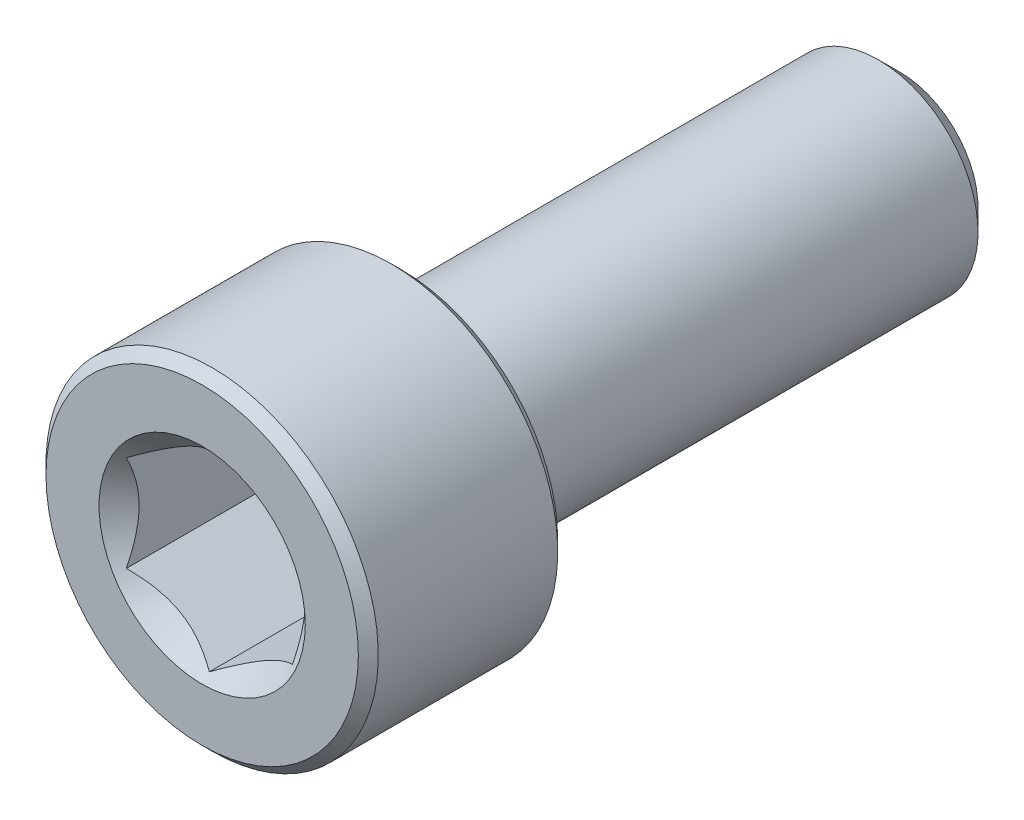
ISO-10303-21;
HEADER;
FILE_DESCRIPTION(('STEP AP214'),'2;1');
FILE_NAME('part.step','',(''),(''),'','','');
FILE_SCHEMA(('AUTOMOTIVE_DESIGN { 1 0 10303 214 1 1 1 1 }'));
ENDSEC;
DATA;
#1=APPLICATION_CONTEXT('core data for automotive mechanical design processes');
#2=APPLICATION_PROTOCOL_DEFINITION('international standard','automotive_design',2000,#1);
#3=PRODUCT_CONTEXT('',#1,'mechanical');
#4=PRODUCT('Part','Part','',(#3));
#5=PRODUCT_RELATED_PRODUCT_CATEGORY('part','',(#4));
#6=PRODUCT_DEFINITION_FORMATION('','',#4);
#7=PRODUCT_DEFINITION_CONTEXT('part definition',#1,'design');
#8=PRODUCT_DEFINITION('design','',#6,#7);
#9=PRODUCT_DEFINITION_SHAPE('','',#8);
#10=(LENGTH_UNIT() NAMED_UNIT(*) SI_UNIT(.MILLI.,.METRE.));
#11=(NAMED_UNIT(*) PLANE_ANGLE_UNIT() SI_UNIT($,.RADIAN.));
#12=(NAMED_UNIT(*) SI_UNIT($,.STERADIAN.) SOLID_ANGLE_UNIT());
#13=UNCERTAINTY_MEASURE_WITH_UNIT(LENGTH_MEASURE(1.E-05),#10,'distance_accuracy_value','');
#14=(GEOMETRIC_REPRESENTATION_CONTEXT(3) GLOBAL_UNCERTAINTY_ASSIGNED_CONTEXT((#13)) GLOBAL_UNIT_ASSIGNED_CONTEXT((#10,
#11,#12)) REPRESENTATION_CONTEXT('',''));
#15=CARTESIAN_POINT('',(0.,0.,0.));
#16=DIRECTION('',(0.,0.,1.));
#17=DIRECTION('',(1.,0.,0.));
#18=AXIS2_PLACEMENT_3D('',#15,#16,#17);
#19=CARTESIAN_POINT('',(0.,2.35048094716167,-10.5));
#20=DIRECTION('',(0.,0.,-1.));
#21=DIRECTION('',(0.,1.,0.));
#22=AXIS2_PLACEMENT_3D('',#19,#20,#21);
#23=PLANE('',#22);
#24=CARTESIAN_POINT('',(0.,0.,-10.5));
#25=DIRECTION('',(0.,0.,-1.));
#26=DIRECTION('',(0.,1.,0.));
#27=AXIS2_PLACEMENT_3D('',#24,#25,#26);
#28=CIRCLE('',#27,2.35048094716167);
#29=CARTESIAN_POINT('',(0.,2.35048094716167,-10.5));
#30=VERTEX_POINT('',#29);
#31=EDGE_CURVE('E54',#30,#30,#28,.T.);
#32=ORIENTED_EDGE('',*,*,#31,.T.);
#33=EDGE_LOOP('',(#32));
#34=FACE_BOUND('',#33,.T.);
#35=ADVANCED_FACE('F41',(#34),#23,.T.);
#36=CARTESIAN_POINT('',(0.,0.,-10.5));
#37=DIRECTION('',(0.,0.,1.));
#38=DIRECTION('',(0.,-1.,0.));
#39=AXIS2_PLACEMENT_3D('',#36,#37,#38);
#40=CONICAL_SURFACE('',#39,2.35048094716167,0.785398163397446);
#41=CARTESIAN_POINT('',(0.,0.,-9.85048094716167));
#42=DIRECTION('',(0.,0.,-1.));
#43=DIRECTION('',(0.,1.,0.));
#44=AXIS2_PLACEMENT_3D('',#41,#42,#43);
#45=CIRCLE('',#44,3.);
#46=CARTESIAN_POINT('',(0.,3.,-9.85048094716167));
#47=VERTEX_POINT('',#46);
#48=EDGE_CURVE('E157',#47,#47,#45,.T.);
#49=ORIENTED_EDGE('',*,*,#48,.T.);
#50=EDGE_LOOP('',(#49));
#51=FACE_BOUND('',#50,.T.);
#52=ORIENTED_EDGE('',*,*,#31,.F.);
#53=EDGE_LOOP('',(#52));
#54=FACE_BOUND('',#53,.T.);
#55=ADVANCED_FACE('F163',(#51,#54),#40,.T.);
#56=CARTESIAN_POINT('',(0.,0.,-10.5));
#57=DIRECTION('',(0.,0.,-1.));
#58=DIRECTION('',(0.,1.,0.));
#59=AXIS2_PLACEMENT_3D('',#56,#57,#58);
#60=CYLINDRICAL_SURFACE('',#59,3.);
#61=CARTESIAN_POINT('',(0.,0.,4.2));
#62=DIRECTION('',(0.,0.,-1.));
#63=DIRECTION('',(0.,1.,0.));
#64=AXIS2_PLACEMENT_3D('',#61,#62,#63);
#65=CIRCLE('',#64,3.);
#66=CARTESIAN_POINT('',(0.,3.,4.2));
#67=VERTEX_POINT('',#66);
#68=EDGE_CURVE('E154',#67,#67,#65,.T.);
#69=ORIENTED_EDGE('',*,*,#68,.T.);
#70=EDGE_LOOP('',(#69));
#71=FACE_BOUND('',#70,.T.);
#72=ORIENTED_EDGE('',*,*,#48,.F.);
#73=EDGE_LOOP('',(#72));
#74=FACE_BOUND('',#73,.T.);
#75=ADVANCED_FACE('F165',(#71,#74),#60,.T.);
#76=CARTESIAN_POINT('',(0.,0.,4.2));
#77=DIRECTION('',(0.,0.,-1.));
#78=DIRECTION('',(0.,1.,0.));
#79=AXIS2_PLACEMENT_3D('',#76,#77,#78);
#80=TOROIDAL_SURFACE('',#79,3.3,0.3);
#81=CARTESIAN_POINT('',(0.,0.,4.5));
#82=DIRECTION('',(0.,0.,-1.));
#83=DIRECTION('',(0.,1.,0.));
#84=AXIS2_PLACEMENT_3D('',#81,#82,#83);
#85=CIRCLE('',#84,3.3);
#86=CARTESIAN_POINT('',(0.,3.3,4.5));
#87=VERTEX_POINT('',#86);
#88=EDGE_CURVE('E151',#87,#87,#85,.T.);
#89=ORIENTED_EDGE('',*,*,#88,.T.);
#90=EDGE_LOOP('',(#89));
#91=FACE_BOUND('',#90,.T.);
#92=ORIENTED_EDGE('',*,*,#68,.F.);
#93=EDGE_LOOP('',(#92));
#94=FACE_BOUND('',#93,.T.);
#95=ADVANCED_FACE('F171',(#91,#94),#80,.F.);
#96=CARTESIAN_POINT('',(0.,4.7,4.5));
#97=DIRECTION('',(0.,0.,-1.));
#98=DIRECTION('',(0.,1.,0.));
#99=AXIS2_PLACEMENT_3D('',#96,#97,#98);
#100=PLANE('',#99);
#101=CARTESIAN_POINT('',(0.,0.,4.5));
#102=DIRECTION('',(0.,0.,-1.));
#103=DIRECTION('',(0.,1.,0.));
#104=AXIS2_PLACEMENT_3D('',#101,#102,#103);
#105=CIRCLE('',#104,4.7);
#106=CARTESIAN_POINT('',(0.,4.7,4.5));
#107=VERTEX_POINT('',#106);
#108=EDGE_CURVE('E148',#107,#107,#105,.T.);
#109=ORIENTED_EDGE('',*,*,#108,.T.);
#110=EDGE_LOOP('',(#109));
#111=FACE_BOUND('',#110,.T.);
#112=ORIENTED_EDGE('',*,*,#88,.F.);
#113=EDGE_LOOP('',(#112));
#114=FACE_BOUND('',#113,.T.);
#115=ADVANCED_FACE('F177',(#111,#114),#100,.T.);
#116=CARTESIAN_POINT('',(0.,0.,4.5));
#117=DIRECTION('',(0.,0.,1.));
#118=DIRECTION('',(0.,-1.,0.));
#119=AXIS2_PLACEMENT_3D('',#116,#117,#118);
#120=CONICAL_SURFACE('',#119,4.7,0.785398163397451);
#121=CARTESIAN_POINT('',(0.,0.,4.8));
#122=DIRECTION('',(0.,0.,-1.));
#123=DIRECTION('',(0.,1.,0.));
#124=AXIS2_PLACEMENT_3D('',#121,#122,#123);
#125=CIRCLE('',#124,5.);
#126=CARTESIAN_POINT('',(0.,5.,4.8));
#127=VERTEX_POINT('',#126);
#128=EDGE_CURVE('E145',#127,#127,#125,.T.);
#129=ORIENTED_EDGE('',*,*,#128,.T.);
#130=EDGE_LOOP('',(#129));
#131=FACE_BOUND('',#130,.T.);
#132=ORIENTED_EDGE('',*,*,#108,.F.);
#133=EDGE_LOOP('',(#132));
#134=FACE_BOUND('',#133,.T.);
#135=ADVANCED_FACE('F181',(#131,#134),#120,.T.);
#136=CARTESIAN_POINT('',(0.,0.,-10.5));
#137=DIRECTION('',(0.,0.,-1.));
#138=DIRECTION('',(0.,1.,0.));
#139=AXIS2_PLACEMENT_3D('',#136,#137,#138);
#140=CYLINDRICAL_SURFACE('',#139,5.);
#141=CARTESIAN_POINT('',(0.,0.,10.2));
#142=DIRECTION('',(0.,0.,-1.));
#143=DIRECTION('',(0.,1.,0.));
#144=AXIS2_PLACEMENT_3D('',#141,#142,#143);
#145=CIRCLE('',#144,5.);
#146=CARTESIAN_POINT('',(0.,5.,10.2));
#147=VERTEX_POINT('',#146);
#148=EDGE_CURVE('E142',#147,#147,#145,.T.);
#149=ORIENTED_EDGE('',*,*,#148,.T.);
#150=EDGE_LOOP('',(#149));
#151=FACE_BOUND('',#150,.T.);
#152=ORIENTED_EDGE('',*,*,#128,.F.);
#153=EDGE_LOOP('',(#152));
#154=FACE_BOUND('',#153,.T.);
#155=ADVANCED_FACE('F185',(#151,#154),#140,.T.);
#156=CARTESIAN_POINT('',(0.,0.,10.2));
#157=DIRECTION('',(0.,0.,-1.));
#158=DIRECTION('',(0.,1.,0.));
#159=AXIS2_PLACEMENT_3D('',#156,#157,#158);
#160=CONICAL_SURFACE('',#159,5.,0.785398163397445);
#161=CARTESIAN_POINT('',(0.,0.,10.5));
#162=DIRECTION('',(0.,0.,-1.));
#163=DIRECTION('',(0.,1.,0.));
#164=AXIS2_PLACEMENT_3D('',#161,#162,#163);
#165=CIRCLE('',#164,4.7);
#166=CARTESIAN_POINT('',(0.,4.7,10.5));
#167=VERTEX_POINT('',#166);
#168=EDGE_CURVE('E139',#167,#167,#165,.T.);
#169=ORIENTED_EDGE('',*,*,#168,.T.);
#170=EDGE_LOOP('',(#169));
#171=FACE_BOUND('',#170,.T.);
#172=ORIENTED_EDGE('',*,*,#148,.F.);
#173=EDGE_LOOP('',(#172));
#174=FACE_BOUND('',#173,.T.);
#175=ADVANCED_FACE('F189',(#171,#174),#160,.T.);
#176=CARTESIAN_POINT('',(0.,0.,10.5));
#177=DIRECTION('',(0.,0.,1.));
#178=DIRECTION('',(0.,-1.,0.));
#179=AXIS2_PLACEMENT_3D('',#176,#177,#178);
#180=PLANE('',#179);
#181=CARTESIAN_POINT('',(0.,0.,10.5));
#182=DIRECTION('',(0.,0.,1.));
#183=DIRECTION('',(1.,0.,0.));
#184=AXIS2_PLACEMENT_3D('',#181,#182,#183);
#185=CIRCLE('',#184,3.10325769689424);
#186=CARTESIAN_POINT('',(3.10325769689424,0.,10.5));
#187=VERTEX_POINT('',#186);
#188=EDGE_CURVE('E113',#187,#187,#185,.T.);
#189=ORIENTED_EDGE('',*,*,#188,.F.);
#190=EDGE_LOOP('',(#189));
#191=FACE_BOUND('',#190,.T.);
#192=ORIENTED_EDGE('',*,*,#168,.F.);
#193=EDGE_LOOP('',(#192));
#194=FACE_BOUND('',#193,.T.);
#195=ADVANCED_FACE('F193',(#191,#194),#180,.T.);
#196=CARTESIAN_POINT('',(0.,0.,10.5));
#197=DIRECTION('',(0.,0.,1.));
#198=DIRECTION('',(1.,0.,0.));
#199=AXIS2_PLACEMENT_3D('',#196,#197,#198);
#200=CONICAL_SURFACE('',#199,3.10325769689424,0.78539816339745);
#201=ORIENTED_EDGE('',*,*,#188,.T.);
#202=EDGE_LOOP('',(#201));
#203=FACE_BOUND('',#202,.T.);
#204=CARTESIAN_POINT('',(-0.000199999999999129,-2.88686681600197,10.2836091260357));
#205=CARTESIAN_POINT('',(0.0857382777877657,-2.83725032818751,10.2340343544086));
#206=CARTESIAN_POINT('',(0.173113567275754,-2.7868041812811,10.1873711304164));
#207=CARTESIAN_POINT('',(0.35128145616559,-2.6839389026696,10.1019317890922));
#208=CARTESIAN_POINT('',(0.442091000681076,-2.6315099876986,10.0632032114599));
#209=CARTESIAN_POINT('',(0.625204123126923,-2.52578957716234,9.99686035295163));
#210=CARTESIAN_POINT('',(0.717461064529342,-2.47252500720904,9.96907931758474));
#211=CARTESIAN_POINT('',(0.904006008776288,-2.3648232334321,9.92627682496456));
#212=CARTESIAN_POINT('',(0.998288312566285,-2.31038931995913,9.91122341572523));
#213=CARTESIAN_POINT('',(1.16077825829185,-2.21657570605387,9.89764137126337));
#214=CARTESIAN_POINT('',(1.22877596788015,-2.17731721011878,9.89563074829469));
#215=CARTESIAN_POINT('',(1.36466024116922,-2.0988643883567,9.89901776624138));
#216=CARTESIAN_POINT('',(1.43254675755224,-2.05967008984862,9.90441800435371));
#217=CARTESIAN_POINT('',(1.56767878823611,-1.98165157555715,9.92231943745636));
#218=CARTESIAN_POINT('',(1.63492349975356,-1.94282782326096,9.93482857610037));
#219=CARTESIAN_POINT('',(1.7682501008182,-1.86585167424616,9.9662611510096));
#220=CARTESIAN_POINT('',(1.83433207909966,-1.82769922629678,9.98518409555071));
#221=CARTESIAN_POINT('',(2.00359634669127,-1.72997445583858,10.0413610104621));
#222=CARTESIAN_POINT('',(2.1057291222229,-1.67100807039231,10.0828494806501));
#223=CARTESIAN_POINT('',(2.25590641494051,-1.58430317001562,10.152887695777));
#224=CARTESIAN_POINT('',(2.30539653988261,-1.55573003305807,10.17749590117));
#225=CARTESIAN_POINT('',(2.40346006383885,-1.49911303110426,10.2289555357691));
#226=CARTESIAN_POINT('',(2.45203400349693,-1.47106885396706,10.2558055878332));
#227=CARTESIAN_POINT('',(2.5002,-1.44326020292023,10.2836091260357));
#228=B_SPLINE_CURVE_WITH_KNOTS('',3,(#204,#205,#206,#207,#208,#209,#210,#211,#212,#213,#214,
#215,#216,#217,#218,#219,#220,#221,#222,#223,#224,#225,#226,#227),.UNSPECIFIED.,.F.,.F.,(4,2,2,
2,2,2,2,2,2,2,2,4),(0.,0.333012085133925,0.667964518301398,0.997597032043301,1.32639954393844,
1.56169424147169,1.79707142102083,2.03271213522171,2.26833478775651,2.64260240809533,
2.82922877818864,3.01574133749025),.UNSPECIFIED.);
#229=CARTESIAN_POINT('',(0.,-2.88675134594813,10.2834936490539));
#230=VERTEX_POINT('',#229);
#231=CARTESIAN_POINT('',(2.5,-1.44337567297406,10.2834936490539));
#232=VERTEX_POINT('',#231);
#233=EDGE_CURVE('E12',#230,#232,#228,.T.);
#234=ORIENTED_EDGE('',*,*,#233,.F.);
#235=CARTESIAN_POINT('',(-2.5002,-1.44326020292023,10.2836091260357));
#236=CARTESIAN_POINT('',(-2.41426172221224,-1.49287669073469,10.2340343544086));
#237=CARTESIAN_POINT('',(-2.32688643272425,-1.5433228376411,10.1873711304164));
#238=CARTESIAN_POINT('',(-2.14871854383441,-1.64618811625259,10.1019317890922));
#239=CARTESIAN_POINT('',(-2.05790899931893,-1.69861703122359,10.0632032114599));
#240=CARTESIAN_POINT('',(-1.87479587687308,-1.80433744175986,9.99686035295163));
#241=CARTESIAN_POINT('',(-1.78253893547066,-1.85760201171315,9.96907931758475));
#242=CARTESIAN_POINT('',(-1.59599399122372,-1.96530378549009,9.92627682496456));
#243=CARTESIAN_POINT('',(-1.50171168743372,-2.01973769896307,9.91122341572524));
#244=CARTESIAN_POINT('',(-1.33922174170816,-2.11355131286833,9.89764137126337));
#245=CARTESIAN_POINT('',(-1.27122403211985,-2.15280980880341,9.89563074829469));
#246=CARTESIAN_POINT('',(-1.13533975883078,-2.23126263056549,9.89901776624138));
#247=CARTESIAN_POINT('',(-1.06745324244776,-2.27045692907358,9.90441800435371));
#248=CARTESIAN_POINT('',(-0.932321211763895,-2.34847544336505,9.92231943745636));
#249=CARTESIAN_POINT('',(-0.865076500246441,-2.38729919566123,9.93482857610037));
#250=CARTESIAN_POINT('',(-0.731749899181802,-2.46427534467604,9.9662611510096));
#251=CARTESIAN_POINT('',(-0.665667920900344,-2.50242779262542,9.98518409555071));
#252=CARTESIAN_POINT('',(-0.496403653308736,-2.60015256308362,10.0413610104621));
#253=CARTESIAN_POINT('',(-0.394270877777108,-2.65911894852989,10.0828494806501));
#254=CARTESIAN_POINT('',(-0.244093585059491,-2.74582384890657,10.152887695777));
#255=CARTESIAN_POINT('',(-0.194603460117391,-2.77439698586412,10.17749590117));
#256=CARTESIAN_POINT('',(-0.0965399361611527,-2.83101398781794,10.2289555357691));
#257=CARTESIAN_POINT('',(-0.0479659965030714,-2.85905816495513,10.2558055878332));
#258=CARTESIAN_POINT('',(0.000200000000000654,-2.88686681600197,10.2836091260357));
#259=B_SPLINE_CURVE_WITH_KNOTS('',3,(#235,#236,#237,#238,#239,#240,#241,#242,#243,#244,#245,
#246,#247,#248,#249,#250,#251,#252,#253,#254,#255,#256,#257,#258),.UNSPECIFIED.,.F.,.F.,(4,2,2,
2,2,2,2,2,2,2,2,4),(0.,0.333012085133924,0.667964518301396,0.997597032043298,1.32639954393844,
1.56169424147169,1.79707142102083,2.03271213522171,2.26833478775651,2.64260240809533,
2.82922877818864,3.01574133749025),.UNSPECIFIED.);
#260=CARTESIAN_POINT('',(-2.5,-1.44337567297407,10.2834936490539));
#261=VERTEX_POINT('',#260);
#262=EDGE_CURVE('E99',#261,#230,#259,.T.);
#263=ORIENTED_EDGE('',*,*,#262,.F.);
#264=CARTESIAN_POINT('',(-2.5,-3.0404429247869,11.3330214063817));
#265=CARTESIAN_POINT('',(-2.5,-2.96709478172557,11.2763788487171));
#266=CARTESIAN_POINT('',(-2.5,-2.89335465135762,11.2202359693275));
#267=CARTESIAN_POINT('',(-2.5,-2.74492905640712,11.1091787819783));
#268=CARTESIAN_POINT('',(-2.5,-2.67024337493575,11.0542647641906));
#269=CARTESIAN_POINT('',(-2.5,-2.51921990828824,10.9455038420407));
#270=CARTESIAN_POINT('',(-2.5,-2.44287382770906,10.891668419147));
#271=CARTESIAN_POINT('',(-2.5,-2.28891665120372,10.7858441602624));
#272=CARTESIAN_POINT('',(-2.5,-2.21130564250585,10.7338551977207));
#273=CARTESIAN_POINT('',(-2.5,-2.04951799142744,10.6288457042913));
#274=CARTESIAN_POINT('',(-2.5,-1.96524215656549,10.5759772332794));
#275=CARTESIAN_POINT('',(-2.5,-1.79473490703969,10.4734987026906));
#276=CARTESIAN_POINT('',(-2.5,-1.70850374831488,10.4238882199388));
#277=CARTESIAN_POINT('',(-2.5,-1.53401833929875,10.3289545270337));
#278=CARTESIAN_POINT('',(-2.5,-1.44577065756376,10.2836193384592));
#279=CARTESIAN_POINT('',(-2.5,-1.26676310994808,10.1982604224777));
#280=CARTESIAN_POINT('',(-2.5,-1.17600446376454,10.158234169168));
#281=CARTESIAN_POINT('',(-2.5,-1.00118351570532,10.0886962875671));
#282=CARTESIAN_POINT('',(-2.5,-0.917385051629537,10.0585280842829));
#283=CARTESIAN_POINT('',(-2.5,-0.747629060099932,10.0048969377877));
#284=CARTESIAN_POINT('',(-2.5,-0.661671397551606,9.98143441527342));
#285=CARTESIAN_POINT('',(-2.5,-0.489622081200869,9.94288576050027));
#286=CARTESIAN_POINT('',(-2.5,-0.403565521298251,9.92764564827246));
#287=CARTESIAN_POINT('',(-2.5,-0.230352389629819,9.90586394924671));
#288=CARTESIAN_POINT('',(-2.5,-0.143196059113862,9.89932048708931));
#289=CARTESIAN_POINT('',(-2.5,0.0273612295446614,9.89550416758395));
#290=CARTESIAN_POINT('',(-2.5,0.110753131974796,9.89782410713133));
#291=CARTESIAN_POINT('',(-2.5,0.276898134935752,9.91066533497266));
#292=CARTESIAN_POINT('',(-2.5,0.359651177707741,9.92118735624098));
#293=CARTESIAN_POINT('',(-2.5,0.52532592779518,9.95001149903142));
#294=CARTESIAN_POINT('',(-2.5,0.608223175291063,9.96845204066539));
#295=CARTESIAN_POINT('',(-2.5,0.772178834557463,10.0120846864152));
#296=CARTESIAN_POINT('',(-2.5,0.853237339741923,10.0372764467107));
#297=CARTESIAN_POINT('',(-2.5,1.10159689599554,10.1241193926927));
#298=CARTESIAN_POINT('',(-2.5,1.2655525401235,10.1953668377804));
#299=CARTESIAN_POINT('',(-2.5,1.50551769780195,10.3142345481021));
#300=CARTESIAN_POINT('',(-2.5,1.58465788064154,10.3559484521643));
#301=CARTESIAN_POINT('',(-2.5,1.74114816885993,10.4426161601922));
#302=CARTESIAN_POINT('',(-2.5,1.81849858456147,10.4875693968529));
#303=CARTESIAN_POINT('',(-2.5,1.96784059769267,10.5777853522682));
#304=CARTESIAN_POINT('',(-2.5,2.03990833441822,10.6229234485208));
#305=CARTESIAN_POINT('',(-2.5,2.18280709640722,10.7151257428437));
#306=CARTESIAN_POINT('',(-2.5,2.2536380285734,10.7621900850232));
#307=CARTESIAN_POINT('',(-2.5,2.39365462675841,10.8575181428367));
#308=CARTESIAN_POINT('',(-2.5,2.46284892785042,10.905769227967));
#309=CARTESIAN_POINT('',(-2.5,2.60028772768958,11.0035675953205));
#310=CARTESIAN_POINT('',(-2.5,2.66853248306037,11.0531145164816));
#311=CARTESIAN_POINT('',(-2.5,2.73637900498552,11.1031920948776));
#312=B_SPLINE_CURVE_WITH_KNOTS('',3,(#264,#265,#266,#267,#268,#269,#270,#271,#272,#273,#274,
#275,#276,#277,#278,#279,#280,#281,#282,#283,#284,#285,#286,#287,#288,#289,#290,#291,#292,#293,
#294,#295,#296,#297,#298,#299,#300,#301,#302,#303,#304,#305,#306,#307,#308,#309,#310,#311),
.UNSPECIFIED.,.F.,.F.,(4,2,2,2,2,2,2,2,2,2,2,2,2,2,2,2,2,2,2,2,2,2,2,4),(0.,0.278024739230089,
0.556114450273836,0.836346737531474,1.11655978131476,1.41496015304213,1.71332168905073,
2.01082076966666,2.30817779353377,2.57513879386764,2.84211653895115,3.10390388797607,
3.36563477559628,3.61548897009284,3.86536549522731,4.11980016461986,4.37422187884309,
4.90887010890445,5.17722912654036,5.44554126009378,5.70061957252692,5.95571700326383,
6.20877059828287,6.46175442014512),.UNSPECIFIED.);
#313=CARTESIAN_POINT('',(-2.5,1.44337567297406,10.2834936490539));
#314=VERTEX_POINT('',#313);
#315=EDGE_CURVE('E112',#314,#261,#312,.F.);
#316=ORIENTED_EDGE('',*,*,#315,.F.);
#317=CARTESIAN_POINT('',(0.000199999999999144,2.88686681600197,10.2836091260357));
#318=CARTESIAN_POINT('',(-0.0857382777877656,2.83725032818751,10.2340343544086));
#319=CARTESIAN_POINT('',(-0.173113567275754,2.7868041812811,10.1873711304164));
#320=CARTESIAN_POINT('',(-0.351281456165589,2.6839389026696,10.1019317890922));
#321=CARTESIAN_POINT('',(-0.442091000681075,2.6315099876986,10.0632032114599));
#322=CARTESIAN_POINT('',(-0.625204123126922,2.52578957716234,9.99686035295163));
#323=CARTESIAN_POINT('',(-0.717461064529341,2.47252500720904,9.96907931758474));
#324=CARTESIAN_POINT('',(-0.904006008776287,2.3648232334321,9.92627682496456));
#325=CARTESIAN_POINT('',(-0.998288312566284,2.31038931995913,9.91122341572523));
#326=CARTESIAN_POINT('',(-1.16077825829185,2.21657570605387,9.89764137126337));
#327=CARTESIAN_POINT('',(-1.22877596788015,2.17731721011878,9.89563074829469));
#328=CARTESIAN_POINT('',(-1.36466024116922,2.0988643883567,9.89901776624138));
#329=CARTESIAN_POINT('',(-1.43254675755224,2.05967008984862,9.90441800435371));
#330=CARTESIAN_POINT('',(-1.56767878823611,1.98165157555715,9.92231943745636));
#331=CARTESIAN_POINT('',(-1.63492349975356,1.94282782326096,9.93482857610037));
#332=CARTESIAN_POINT('',(-1.7682501008182,1.86585167424616,9.9662611510096));
#333=CARTESIAN_POINT('',(-1.83433207909966,1.82769922629677,9.98518409555071));
#334=CARTESIAN_POINT('',(-2.00359634669127,1.72997445583858,10.0413610104621));
#335=CARTESIAN_POINT('',(-2.10572912222289,1.67100807039231,10.0828494806501));
#336=CARTESIAN_POINT('',(-2.25590641494051,1.58430317001562,10.152887695777));
#337=CARTESIAN_POINT('',(-2.30539653988261,1.55573003305807,10.17749590117));
#338=CARTESIAN_POINT('',(-2.40346006383885,1.49911303110426,10.2289555357691));
#339=CARTESIAN_POINT('',(-2.45203400349693,1.47106885396706,10.2558055878332));
#340=CARTESIAN_POINT('',(-2.5002,1.44326020292023,10.2836091260357));
#341=B_SPLINE_CURVE_WITH_KNOTS('',3,(#317,#318,#319,#320,#321,#322,#323,#324,#325,#326,#327,
#328,#329,#330,#331,#332,#333,#334,#335,#336,#337,#338,#339,#340),.UNSPECIFIED.,.F.,.F.,(4,2,2,
2,2,2,2,2,2,2,2,4),(0.,0.333012085133924,0.667964518301397,0.9975970320433,1.32639954393844,
1.56169424147169,1.79707142102083,2.03271213522171,2.26833478775651,2.64260240809533,
2.82922877818864,3.01574133749025),.UNSPECIFIED.);
#342=CARTESIAN_POINT('',(0.,2.88675134594813,10.2834936490539));
#343=VERTEX_POINT('',#342);
#344=EDGE_CURVE('E243',#343,#314,#341,.T.);
#345=ORIENTED_EDGE('',*,*,#344,.F.);
#346=CARTESIAN_POINT('',(2.5002,1.44326020292023,10.2836091260357));
#347=CARTESIAN_POINT('',(2.41426172221224,1.49287669073469,10.2340343544086));
#348=CARTESIAN_POINT('',(2.32688643272425,1.5433228376411,10.1873711304164));
#349=CARTESIAN_POINT('',(2.14871854383441,1.64618811625259,10.1019317890922));
#350=CARTESIAN_POINT('',(2.05790899931893,1.69861703122359,10.0632032114599));
#351=CARTESIAN_POINT('',(1.87479587687308,1.80433744175986,9.99686035295163));
#352=CARTESIAN_POINT('',(1.78253893547066,1.85760201171315,9.96907931758474));
#353=CARTESIAN_POINT('',(1.59599399122371,1.96530378549009,9.92627682496456));
#354=CARTESIAN_POINT('',(1.50171168743372,2.01973769896307,9.91122341572523));
#355=CARTESIAN_POINT('',(1.33922174170815,2.11355131286833,9.89764137126337));
#356=CARTESIAN_POINT('',(1.27122403211985,2.15280980880341,9.89563074829469));
#357=CARTESIAN_POINT('',(1.13533975883078,2.23126263056549,9.89901776624138));
#358=CARTESIAN_POINT('',(1.06745324244776,2.27045692907357,9.90441800435371));
#359=CARTESIAN_POINT('',(0.932321211763894,2.34847544336505,9.92231943745636));
#360=CARTESIAN_POINT('',(0.865076500246439,2.38729919566123,9.93482857610037));
#361=CARTESIAN_POINT('',(0.731749899181801,2.46427534467603,9.9662611510096));
#362=CARTESIAN_POINT('',(0.665667920900343,2.50242779262542,9.98518409555071));
#363=CARTESIAN_POINT('',(0.496403653308736,2.60015256308362,10.0413610104621));
#364=CARTESIAN_POINT('',(0.394270877777107,2.65911894852989,10.0828494806501));
#365=CARTESIAN_POINT('',(0.244093585059491,2.74582384890657,10.152887695777));
#366=CARTESIAN_POINT('',(0.19460346011739,2.77439698586412,10.17749590117));
#367=CARTESIAN_POINT('',(0.0965399361611524,2.83101398781794,10.2289555357691));
#368=CARTESIAN_POINT('',(0.0479659965030712,2.85905816495513,10.2558055878332));
#369=CARTESIAN_POINT('',(-0.00020000000000088,2.88686681600197,10.2836091260357));
#370=B_SPLINE_CURVE_WITH_KNOTS('',3,(#346,#347,#348,#349,#350,#351,#352,#353,#354,#355,#356,
#357,#358,#359,#360,#361,#362,#363,#364,#365,#366,#367,#368,#369),.UNSPECIFIED.,.F.,.F.,(4,2,2,
2,2,2,2,2,2,2,2,4),(0.,0.333012085133925,0.667964518301397,0.9975970320433,1.32639954393844,
1.56169424147169,1.79707142102083,2.03271213522171,2.26833478775651,2.64260240809533,
2.82922877818864,3.01574133749025),.UNSPECIFIED.);
#371=CARTESIAN_POINT('',(2.5,1.44337567297406,10.2834936490539));
#372=VERTEX_POINT('',#371);
#373=EDGE_CURVE('E216',#372,#343,#370,.T.);
#374=ORIENTED_EDGE('',*,*,#373,.F.);
#375=CARTESIAN_POINT('',(2.5,-3.0404429247869,11.3330214063817));
#376=CARTESIAN_POINT('',(2.5,-2.96709478172556,11.2763788487171));
#377=CARTESIAN_POINT('',(2.5,-2.89335465135762,11.2202359693275));
#378=CARTESIAN_POINT('',(2.5,-2.74492905640712,11.1091787819783));
#379=CARTESIAN_POINT('',(2.5,-2.67024337493575,11.0542647641906));
#380=CARTESIAN_POINT('',(2.5,-2.51921990828824,10.9455038420407));
#381=CARTESIAN_POINT('',(2.5,-2.44287382770905,10.891668419147));
#382=CARTESIAN_POINT('',(2.5,-2.28891665120372,10.7858441602624));
#383=CARTESIAN_POINT('',(2.5,-2.21130564250584,10.7338551977207));
#384=CARTESIAN_POINT('',(2.5,-2.04951799142744,10.6288457042913));
#385=CARTESIAN_POINT('',(2.5,-1.96524215656549,10.5759772332794));
#386=CARTESIAN_POINT('',(2.5,-1.79473490703968,10.4734987026906));
#387=CARTESIAN_POINT('',(2.5,-1.70850374831487,10.4238882199388));
#388=CARTESIAN_POINT('',(2.5,-1.53401833929875,10.3289545270337));
#389=CARTESIAN_POINT('',(2.5,-1.44577065756376,10.2836193384592));
#390=CARTESIAN_POINT('',(2.5,-1.26676310994808,10.1982604224777));
#391=CARTESIAN_POINT('',(2.5,-1.17600446376454,10.158234169168));
#392=CARTESIAN_POINT('',(2.5,-1.00118351570532,10.0886962875671));
#393=CARTESIAN_POINT('',(2.5,-0.917385051629536,10.0585280842829));
#394=CARTESIAN_POINT('',(2.5,-0.747629060099932,10.0048969377877));
#395=CARTESIAN_POINT('',(2.5,-0.661671397551605,9.98143441527342));
#396=CARTESIAN_POINT('',(2.5,-0.489622081200868,9.94288576050027));
#397=CARTESIAN_POINT('',(2.5,-0.40356552129825,9.92764564827246));
#398=CARTESIAN_POINT('',(2.5,-0.230352389629819,9.90586394924671));
#399=CARTESIAN_POINT('',(2.5,-0.143196059113862,9.89932048708931));
#400=CARTESIAN_POINT('',(2.5,0.0273612295446616,9.89550416758395));
#401=CARTESIAN_POINT('',(2.5,0.110753131974796,9.89782410713133));
#402=CARTESIAN_POINT('',(2.5,0.276898134935752,9.91066533497266));
#403=CARTESIAN_POINT('',(2.5,0.359651177707741,9.92118735624098));
#404=CARTESIAN_POINT('',(2.5,0.525325927795179,9.95001149903142));
#405=CARTESIAN_POINT('',(2.5,0.608223175291062,9.96845204066539));
#406=CARTESIAN_POINT('',(2.5,0.772178834557463,10.0120846864152));
#407=CARTESIAN_POINT('',(2.5,0.853237339741923,10.0372764467107));
#408=CARTESIAN_POINT('',(2.5,1.10159689599554,10.1241193926927));
#409=CARTESIAN_POINT('',(2.5,1.2655525401235,10.1953668377804));
#410=CARTESIAN_POINT('',(2.5,1.50551769780196,10.3142345481021));
#411=CARTESIAN_POINT('',(2.5,1.58465788064155,10.3559484521643));
#412=CARTESIAN_POINT('',(2.5,1.74114816885993,10.4426161601922));
#413=CARTESIAN_POINT('',(2.5,1.81849858456147,10.4875693968529));
#414=CARTESIAN_POINT('',(2.5,1.96784059769267,10.5777853522682));
#415=CARTESIAN_POINT('',(2.5,2.03990833441822,10.6229234485208));
#416=CARTESIAN_POINT('',(2.5,2.18280709640722,10.7151257428437));
#417=CARTESIAN_POINT('',(2.5,2.2536380285734,10.7621900850232));
#418=CARTESIAN_POINT('',(2.5,2.39365462675841,10.8575181428367));
#419=CARTESIAN_POINT('',(2.5,2.46284892785042,10.905769227967));
#420=CARTESIAN_POINT('',(2.5,2.60028772768958,11.0035675953205));
#421=CARTESIAN_POINT('',(2.5,2.66853248306037,11.0531145164816));
#422=CARTESIAN_POINT('',(2.5,2.73637900498552,11.1031920948776));
#423=B_SPLINE_CURVE_WITH_KNOTS('',3,(#375,#376,#377,#378,#379,#380,#381,#382,#383,#384,#385,
#386,#387,#388,#389,#390,#391,#392,#393,#394,#395,#396,#397,#398,#399,#400,#401,#402,#403,#404,
#405,#406,#407,#408,#409,#410,#411,#412,#413,#414,#415,#416,#417,#418,#419,#420,#421,#422),
.UNSPECIFIED.,.F.,.F.,(4,2,2,2,2,2,2,2,2,2,2,2,2,2,2,2,2,2,2,2,2,2,2,4),(0.,0.278024739230086,
0.556114450273835,0.836346737531472,1.11655978131475,1.41496015304213,1.71332168905072,
2.01082076966666,2.30817779353377,2.57513879386763,2.84211653895115,3.10390388797606,
3.36563477559628,3.61548897009283,3.86536549522731,4.11980016461985,4.37422187884308,
4.90887010890445,5.17722912654036,5.44554126009378,5.70061957252692,5.95571700326383,
6.20877059828286,6.46175442014511),.UNSPECIFIED.);
#424=EDGE_CURVE('E61',#232,#372,#423,.T.);
#425=ORIENTED_EDGE('',*,*,#424,.F.);
#426=EDGE_LOOP('',(#234,#263,#316,#345,#374,#425));
#427=FACE_BOUND('',#426,.T.);
#428=ADVANCED_FACE('F98',(#203,#427),#200,.F.);
#429=CARTESIAN_POINT('',(0.,4.7,5.5));
#430=DIRECTION('',(0.,0.,-1.));
#431=DIRECTION('',(0.,1.,0.));
#432=AXIS2_PLACEMENT_3D('',#429,#430,#431);
#433=PLANE('',#432);
#434=DIRECTION('',(0.866025403784438,0.5,0.));
#435=VECTOR('',#434,1.);
#436=CARTESIAN_POINT('',(0.,-2.88675134594813,5.5));
#437=LINE('',#436,#435);
#438=CARTESIAN_POINT('',(0.,-2.88675134594813,5.5));
#439=VERTEX_POINT('',#438);
#440=CARTESIAN_POINT('',(2.5,-1.44337567297406,5.5));
#441=VERTEX_POINT('',#440);
#442=EDGE_CURVE('E116',#439,#441,#437,.T.);
#443=ORIENTED_EDGE('',*,*,#442,.T.);
#444=DIRECTION('',(0.,1.,0.));
#445=VECTOR('',#444,1.);
#446=CARTESIAN_POINT('',(2.5,-1.44337567297406,5.5));
#447=LINE('',#446,#445);
#448=CARTESIAN_POINT('',(2.5,1.44337567297406,5.5));
#449=VERTEX_POINT('',#448);
#450=EDGE_CURVE('E68',#441,#449,#447,.T.);
#451=ORIENTED_EDGE('',*,*,#450,.T.);
#452=DIRECTION('',(-0.866025403784439,0.5,0.));
#453=VECTOR('',#452,1.);
#454=CARTESIAN_POINT('',(2.5,1.44337567297406,5.5));
#455=LINE('',#454,#453);
#456=CARTESIAN_POINT('',(0.,2.88675134594813,5.5));
#457=VERTEX_POINT('',#456);
#458=EDGE_CURVE('E124',#449,#457,#455,.T.);
#459=ORIENTED_EDGE('',*,*,#458,.T.);
#460=DIRECTION('',(-0.866025403784439,-0.5,0.));
#461=VECTOR('',#460,1.);
#462=CARTESIAN_POINT('',(0.,2.88675134594813,5.5));
#463=LINE('',#462,#461);
#464=CARTESIAN_POINT('',(-2.5,1.44337567297406,5.5));
#465=VERTEX_POINT('',#464);
#466=EDGE_CURVE('E131',#457,#465,#463,.T.);
#467=ORIENTED_EDGE('',*,*,#466,.T.);
#468=DIRECTION('',(0.,-1.,0.));
#469=VECTOR('',#468,1.);
#470=CARTESIAN_POINT('',(-2.5,1.44337567297406,5.5));
#471=LINE('',#470,#469);
#472=CARTESIAN_POINT('',(-2.5,-1.44337567297406,5.5));
#473=VERTEX_POINT('',#472);
#474=EDGE_CURVE('E127',#465,#473,#471,.T.);
#475=ORIENTED_EDGE('',*,*,#474,.T.);
#476=DIRECTION('',(0.866025403784439,-0.5,0.));
#477=VECTOR('',#476,1.);
#478=CARTESIAN_POINT('',(-2.5,-1.44337567297407,5.5));
#479=LINE('',#478,#477);
#480=EDGE_CURVE('E117',#473,#439,#479,.T.);
#481=ORIENTED_EDGE('',*,*,#480,.T.);
#482=EDGE_LOOP('',(#443,#451,#459,#467,#475,#481));
#483=FACE_BOUND('',#482,.T.);
#484=ADVANCED_FACE('F198',(#483),#433,.F.);
#485=CARTESIAN_POINT('',(0.,-2.88675134594813,-3.13762615825973));
#486=DIRECTION('',(0.5,-0.866025403784438,0.));
#487=DIRECTION('',(0.866025403784438,0.5,0.));
#488=AXIS2_PLACEMENT_3D('',#485,#486,#487);
#489=PLANE('',#488);
#490=DIRECTION('',(0.,0.,1.));
#491=VECTOR('',#490,1.);
#492=CARTESIAN_POINT('',(0.,-2.88675134594813,-3.13762615825973));
#493=LINE('',#492,#491);
#494=EDGE_CURVE('E108',#439,#230,#493,.T.);
#495=ORIENTED_EDGE('',*,*,#494,.T.);
#496=ORIENTED_EDGE('',*,*,#233,.T.);
#497=DIRECTION('',(0.,0.,1.));
#498=VECTOR('',#497,1.);
#499=CARTESIAN_POINT('',(2.5,-1.44337567297406,-3.13762615825973));
#500=LINE('',#499,#498);
#501=EDGE_CURVE('E119',#441,#232,#500,.T.);
#502=ORIENTED_EDGE('',*,*,#501,.F.);
#503=ORIENTED_EDGE('',*,*,#442,.F.);
#504=EDGE_LOOP('',(#495,#496,#502,#503));
#505=FACE_BOUND('',#504,.T.);
#506=ADVANCED_FACE('F115',(#505),#489,.F.);
#507=CARTESIAN_POINT('',(-2.5,-1.44337567297407,-3.13762615825973));
#508=DIRECTION('',(-0.5,-0.866025403784439,0.));
#509=DIRECTION('',(0.866025403784439,-0.5,0.));
#510=AXIS2_PLACEMENT_3D('',#507,#508,#509);
#511=PLANE('',#510);
#512=DIRECTION('',(0.,0.,1.));
#513=VECTOR('',#512,1.);
#514=CARTESIAN_POINT('',(-2.5,-1.44337567297407,-3.13762615825973));
#515=LINE('',#514,#513);
#516=EDGE_CURVE('E111',#473,#261,#515,.T.);
#517=ORIENTED_EDGE('',*,*,#516,.T.);
#518=ORIENTED_EDGE('',*,*,#262,.T.);
#519=ORIENTED_EDGE('',*,*,#494,.F.);
#520=ORIENTED_EDGE('',*,*,#480,.F.);
#521=EDGE_LOOP('',(#517,#518,#519,#520));
#522=FACE_BOUND('',#521,.T.);
#523=ADVANCED_FACE('F107',(#522),#511,.F.);
#524=CARTESIAN_POINT('',(-2.5,1.44337567297406,-3.13762615825973));
#525=DIRECTION('',(-1.,0.,0.));
#526=DIRECTION('',(0.,0.,1.));
#527=AXIS2_PLACEMENT_3D('',#524,#525,#526);
#528=PLANE('',#527);
#529=DIRECTION('',(0.,0.,1.));
#530=VECTOR('',#529,1.);
#531=CARTESIAN_POINT('',(-2.5,1.44337567297406,-3.13762615825973));
#532=LINE('',#531,#530);
#533=EDGE_CURVE('E128',#465,#314,#532,.T.);
#534=ORIENTED_EDGE('',*,*,#533,.T.);
#535=ORIENTED_EDGE('',*,*,#315,.T.);
#536=ORIENTED_EDGE('',*,*,#516,.F.);
#537=ORIENTED_EDGE('',*,*,#474,.F.);
#538=EDGE_LOOP('',(#534,#535,#536,#537));
#539=FACE_BOUND('',#538,.T.);
#540=ADVANCED_FACE('F252',(#539),#528,.F.);
#541=CARTESIAN_POINT('',(0.,2.88675134594813,-3.13762615825973));
#542=DIRECTION('',(-0.5,0.866025403784438,0.));
#543=DIRECTION('',(-0.866025403784439,-0.5,0.));
#544=AXIS2_PLACEMENT_3D('',#541,#542,#543);
#545=PLANE('',#544);
#546=DIRECTION('',(0.,0.,1.));
#547=VECTOR('',#546,1.);
#548=CARTESIAN_POINT('',(0.,2.88675134594813,-3.13762615825973));
#549=LINE('',#548,#547);
#550=EDGE_CURVE('E132',#457,#343,#549,.T.);
#551=ORIENTED_EDGE('',*,*,#550,.T.);
#552=ORIENTED_EDGE('',*,*,#344,.T.);
#553=ORIENTED_EDGE('',*,*,#533,.F.);
#554=ORIENTED_EDGE('',*,*,#466,.F.);
#555=EDGE_LOOP('',(#551,#552,#553,#554));
#556=FACE_BOUND('',#555,.T.);
#557=ADVANCED_FACE('F249',(#556),#545,.F.);
#558=CARTESIAN_POINT('',(2.5,1.44337567297406,-3.13762615825973));
#559=DIRECTION('',(0.5,0.866025403784439,0.));
#560=DIRECTION('',(-0.866025403784439,0.5,0.));
#561=AXIS2_PLACEMENT_3D('',#558,#559,#560);
#562=PLANE('',#561);
#563=DIRECTION('',(0.,0.,1.));
#564=VECTOR('',#563,1.);
#565=CARTESIAN_POINT('',(2.5,1.44337567297406,-3.13762615825973));
#566=LINE('',#565,#564);
#567=EDGE_CURVE('E135',#449,#372,#566,.T.);
#568=ORIENTED_EDGE('',*,*,#567,.T.);
#569=ORIENTED_EDGE('',*,*,#373,.T.);
#570=ORIENTED_EDGE('',*,*,#550,.F.);
#571=ORIENTED_EDGE('',*,*,#458,.F.);
#572=EDGE_LOOP('',(#568,#569,#570,#571));
#573=FACE_BOUND('',#572,.T.);
#574=ADVANCED_FACE('F206',(#573),#562,.F.);
#575=CARTESIAN_POINT('',(2.5,-1.44337567297406,-3.13762615825973));
#576=DIRECTION('',(1.,0.,0.));
#577=DIRECTION('',(0.,0.,-1.));
#578=AXIS2_PLACEMENT_3D('',#575,#576,#577);
#579=PLANE('',#578);
#580=ORIENTED_EDGE('',*,*,#501,.T.);
#581=ORIENTED_EDGE('',*,*,#424,.T.);
#582=ORIENTED_EDGE('',*,*,#567,.F.);
#583=ORIENTED_EDGE('',*,*,#450,.F.);
#584=EDGE_LOOP('',(#580,#581,#582,#583));
#585=FACE_BOUND('',#584,.T.);
#586=ADVANCED_FACE('F202',(#585),#579,.F.);
#587=CLOSED_SHELL('',(#35,#55,#75,#95,#115,#135,#155,#175,#195,#428,#484,#506,#523,#540,#557,
#574,#586));
#588=MANIFOLD_SOLID_BREP('B2',#587);
#589=ADVANCED_BREP_SHAPE_REPRESENTATION('',(#18,#588),#14);
#590=SHAPE_DEFINITION_REPRESENTATION(#9,#589);
ENDSEC;
END-ISO-10303-21;
